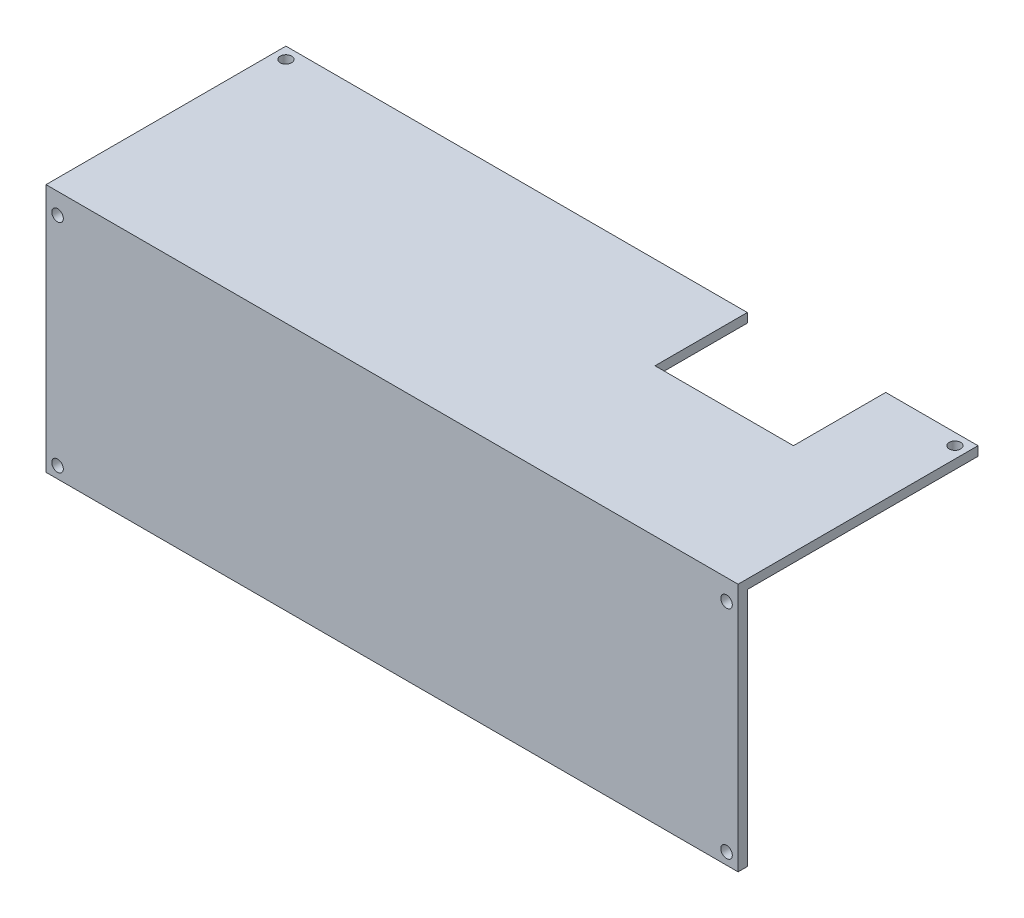
ISO-10303-21;
HEADER;
FILE_DESCRIPTION(('STEP AP214'),'2;1');
FILE_NAME('part.step','',(''),(''),'','','');
FILE_SCHEMA(('AUTOMOTIVE_DESIGN { 1 0 10303 214 1 1 1 1 }'));
ENDSEC;
DATA;
#1=APPLICATION_CONTEXT('core data for automotive mechanical design processes');
#2=APPLICATION_PROTOCOL_DEFINITION('international standard','automotive_design',2000,#1);
#3=PRODUCT_CONTEXT('',#1,'mechanical');
#4=PRODUCT('Part','Part','',(#3));
#5=PRODUCT_RELATED_PRODUCT_CATEGORY('part','',(#4));
#6=PRODUCT_DEFINITION_FORMATION('','',#4);
#7=PRODUCT_DEFINITION_CONTEXT('part definition',#1,'design');
#8=PRODUCT_DEFINITION('design','',#6,#7);
#9=PRODUCT_DEFINITION_SHAPE('','',#8);
#10=(LENGTH_UNIT() NAMED_UNIT(*) SI_UNIT(.MILLI.,.METRE.));
#11=(NAMED_UNIT(*) PLANE_ANGLE_UNIT() SI_UNIT($,.RADIAN.));
#12=(NAMED_UNIT(*) SI_UNIT($,.STERADIAN.) SOLID_ANGLE_UNIT());
#13=UNCERTAINTY_MEASURE_WITH_UNIT(LENGTH_MEASURE(1.E-05),#10,'distance_accuracy_value','');
#14=(GEOMETRIC_REPRESENTATION_CONTEXT(3) GLOBAL_UNCERTAINTY_ASSIGNED_CONTEXT((#13)) GLOBAL_UNIT_ASSIGNED_CONTEXT((#10,
#11,#12)) REPRESENTATION_CONTEXT('',''));
#15=CARTESIAN_POINT('',(0.,0.,0.));
#16=DIRECTION('',(0.,0.,1.));
#17=DIRECTION('',(1.,0.,0.));
#18=AXIS2_PLACEMENT_3D('',#15,#16,#17);
#19=CARTESIAN_POINT('',(0.,52.,0.));
#20=DIRECTION('',(0.,1.,0.));
#21=DIRECTION('',(0.,0.,1.));
#22=AXIS2_PLACEMENT_3D('',#19,#20,#21);
#23=PLANE('',#22);
#24=CARTESIAN_POINT('',(147.5,52.,-47.5));
#25=DIRECTION('',(0.,1.,0.));
#26=DIRECTION('',(0.,0.,1.));
#27=AXIS2_PLACEMENT_3D('',#24,#25,#26);
#28=CIRCLE('',#27,1.24999999999998);
#29=CARTESIAN_POINT('',(147.5,52.,-46.25));
#30=VERTEX_POINT('',#29);
#31=EDGE_CURVE('E433',#30,#30,#28,.T.);
#32=ORIENTED_EDGE('',*,*,#31,.T.);
#33=EDGE_LOOP('',(#32));
#34=FACE_BOUND('',#33,.T.);
#35=CARTESIAN_POINT('',(2.5,52.,-47.5));
#36=DIRECTION('',(0.,1.,0.));
#37=DIRECTION('',(0.,0.,1.));
#38=AXIS2_PLACEMENT_3D('',#35,#36,#37);
#39=CIRCLE('',#38,1.25);
#40=CARTESIAN_POINT('',(2.5,52.,-46.25));
#41=VERTEX_POINT('',#40);
#42=EDGE_CURVE('E444',#41,#41,#39,.T.);
#43=ORIENTED_EDGE('',*,*,#42,.T.);
#44=EDGE_LOOP('',(#43));
#45=FACE_BOUND('',#44,.T.);
#46=DIRECTION('',(0.,0.,1.));
#47=VECTOR('',#46,1.);
#48=CARTESIAN_POINT('',(100.,52.,0.));
#49=LINE('',#48,#47);
#50=CARTESIAN_POINT('',(100.,52.,-50.));
#51=VERTEX_POINT('',#50);
#52=CARTESIAN_POINT('',(100.,52.,-30.));
#53=VERTEX_POINT('',#52);
#54=EDGE_CURVE('E402',#51,#53,#49,.T.);
#55=ORIENTED_EDGE('',*,*,#54,.T.);
#56=DIRECTION('',(-1.,0.,0.));
#57=VECTOR('',#56,1.);
#58=CARTESIAN_POINT('',(0.,52.,-30.));
#59=LINE('',#58,#57);
#60=CARTESIAN_POINT('',(130.,52.,-30.));
#61=VERTEX_POINT('',#60);
#62=EDGE_CURVE('E410',#61,#53,#59,.T.);
#63=ORIENTED_EDGE('',*,*,#62,.F.);
#64=DIRECTION('',(0.,0.,1.));
#65=VECTOR('',#64,1.);
#66=CARTESIAN_POINT('',(130.,52.,0.));
#67=LINE('',#66,#65);
#68=CARTESIAN_POINT('',(130.,52.,-50.));
#69=VERTEX_POINT('',#68);
#70=EDGE_CURVE('E432',#69,#61,#67,.T.);
#71=ORIENTED_EDGE('',*,*,#70,.F.);
#72=DIRECTION('',(-1.,0.,0.));
#73=VECTOR('',#72,1.);
#74=CARTESIAN_POINT('',(150.,52.,-50.));
#75=LINE('',#74,#73);
#76=CARTESIAN_POINT('',(150.,52.,-50.));
#77=VERTEX_POINT('',#76);
#78=EDGE_CURVE('E111',#77,#69,#75,.T.);
#79=ORIENTED_EDGE('',*,*,#78,.F.);
#80=DIRECTION('',(0.,0.,-1.));
#81=VECTOR('',#80,1.);
#82=CARTESIAN_POINT('',(150.,52.,2.));
#83=LINE('',#82,#81);
#84=CARTESIAN_POINT('',(150.,52.,0.));
#85=VERTEX_POINT('',#84);
#86=EDGE_CURVE('E89',#85,#77,#83,.T.);
#87=ORIENTED_EDGE('',*,*,#86,.F.);
#88=DIRECTION('',(-1.,0.,0.));
#89=VECTOR('',#88,1.);
#90=CARTESIAN_POINT('',(0.,52.,0.));
#91=LINE('',#90,#89);
#92=CARTESIAN_POINT('',(0.,52.,0.));
#93=VERTEX_POINT('',#92);
#94=EDGE_CURVE('E99',#85,#93,#91,.T.);
#95=ORIENTED_EDGE('',*,*,#94,.T.);
#96=DIRECTION('',(0.,0.,1.));
#97=VECTOR('',#96,1.);
#98=CARTESIAN_POINT('',(0.,52.,2.));
#99=LINE('',#98,#97);
#100=CARTESIAN_POINT('',(0.,52.,-50.));
#101=VERTEX_POINT('',#100);
#102=EDGE_CURVE('E130',#101,#93,#99,.T.);
#103=ORIENTED_EDGE('',*,*,#102,.F.);
#104=EDGE_CURVE('E114',#51,#101,#75,.T.);
#105=ORIENTED_EDGE('',*,*,#104,.F.);
#106=EDGE_LOOP('',(#55,#63,#71,#79,#87,#95,#103,#105));
#107=FACE_BOUND('',#106,.T.);
#108=ADVANCED_FACE('F42',(#34,#45,#107),#23,.F.);
#109=CARTESIAN_POINT('',(150.,54.,-50.));
#110=DIRECTION('',(0.,0.,1.));
#111=DIRECTION('',(1.,0.,0.));
#112=AXIS2_PLACEMENT_3D('',#109,#110,#111);
#113=PLANE('',#112);
#114=DIRECTION('',(0.,-1.,0.));
#115=VECTOR('',#114,1.);
#116=CARTESIAN_POINT('',(100.,54.,-50.));
#117=LINE('',#116,#115);
#118=CARTESIAN_POINT('',(100.,54.,-50.));
#119=VERTEX_POINT('',#118);
#120=EDGE_CURVE('E399',#119,#51,#117,.T.);
#121=ORIENTED_EDGE('',*,*,#120,.T.);
#122=ORIENTED_EDGE('',*,*,#104,.T.);
#123=DIRECTION('',(0.,-1.,0.));
#124=VECTOR('',#123,1.);
#125=CARTESIAN_POINT('',(0.,54.,-50.));
#126=LINE('',#125,#124);
#127=CARTESIAN_POINT('',(0.,54.,-50.));
#128=VERTEX_POINT('',#127);
#129=EDGE_CURVE('E134',#128,#101,#126,.T.);
#130=ORIENTED_EDGE('',*,*,#129,.F.);
#131=DIRECTION('',(-1.,0.,0.));
#132=VECTOR('',#131,1.);
#133=CARTESIAN_POINT('',(150.,54.,-50.));
#134=LINE('',#133,#132);
#135=EDGE_CURVE('E407',#119,#128,#134,.T.);
#136=ORIENTED_EDGE('',*,*,#135,.F.);
#137=EDGE_LOOP('',(#121,#122,#130,#136));
#138=FACE_BOUND('',#137,.T.);
#139=ADVANCED_FACE('F187',(#138),#113,.F.);
#140=CARTESIAN_POINT('',(0.,54.,0.));
#141=DIRECTION('',(0.,1.,0.));
#142=DIRECTION('',(0.,0.,1.));
#143=AXIS2_PLACEMENT_3D('',#140,#141,#142);
#144=PLANE('',#143);
#145=CARTESIAN_POINT('',(147.5,54.,-47.5));
#146=DIRECTION('',(0.,1.,0.));
#147=DIRECTION('',(0.,0.,1.));
#148=AXIS2_PLACEMENT_3D('',#145,#146,#147);
#149=CIRCLE('',#148,1.24999999999998);
#150=CARTESIAN_POINT('',(147.5,54.,-46.25));
#151=VERTEX_POINT('',#150);
#152=EDGE_CURVE('E440',#151,#151,#149,.T.);
#153=ORIENTED_EDGE('',*,*,#152,.F.);
#154=EDGE_LOOP('',(#153));
#155=FACE_BOUND('',#154,.T.);
#156=CARTESIAN_POINT('',(2.5,54.,-47.5));
#157=DIRECTION('',(0.,1.,0.));
#158=DIRECTION('',(0.,0.,1.));
#159=AXIS2_PLACEMENT_3D('',#156,#157,#158);
#160=CIRCLE('',#159,1.25);
#161=CARTESIAN_POINT('',(2.5,54.,-46.25));
#162=VERTEX_POINT('',#161);
#163=EDGE_CURVE('E449',#162,#162,#160,.T.);
#164=ORIENTED_EDGE('',*,*,#163,.F.);
#165=EDGE_LOOP('',(#164));
#166=FACE_BOUND('',#165,.T.);
#167=DIRECTION('',(-1.,0.,0.));
#168=VECTOR('',#167,1.);
#169=CARTESIAN_POINT('',(0.,54.,-30.));
#170=LINE('',#169,#168);
#171=CARTESIAN_POINT('',(130.,54.,-30.));
#172=VERTEX_POINT('',#171);
#173=CARTESIAN_POINT('',(100.,54.,-30.));
#174=VERTEX_POINT('',#173);
#175=EDGE_CURVE('E57',#172,#174,#170,.T.);
#176=ORIENTED_EDGE('',*,*,#175,.T.);
#177=DIRECTION('',(0.,0.,1.));
#178=VECTOR('',#177,1.);
#179=CARTESIAN_POINT('',(100.,54.,0.));
#180=LINE('',#179,#178);
#181=EDGE_CURVE('E401',#119,#174,#180,.T.);
#182=ORIENTED_EDGE('',*,*,#181,.F.);
#183=ORIENTED_EDGE('',*,*,#135,.T.);
#184=DIRECTION('',(0.,0.,1.));
#185=VECTOR('',#184,1.);
#186=CARTESIAN_POINT('',(0.,54.,2.));
#187=LINE('',#186,#185);
#188=CARTESIAN_POINT('',(0.,54.,2.));
#189=VERTEX_POINT('',#188);
#190=EDGE_CURVE('E418',#128,#189,#187,.T.);
#191=ORIENTED_EDGE('',*,*,#190,.T.);
#192=DIRECTION('',(1.,0.,0.));
#193=VECTOR('',#192,1.);
#194=CARTESIAN_POINT('',(150.,54.,2.));
#195=LINE('',#194,#193);
#196=CARTESIAN_POINT('',(150.,54.,2.));
#197=VERTEX_POINT('',#196);
#198=EDGE_CURVE('E126',#189,#197,#195,.T.);
#199=ORIENTED_EDGE('',*,*,#198,.T.);
#200=DIRECTION('',(0.,0.,-1.));
#201=VECTOR('',#200,1.);
#202=CARTESIAN_POINT('',(150.,54.,2.));
#203=LINE('',#202,#201);
#204=CARTESIAN_POINT('',(150.,54.,-50.));
#205=VERTEX_POINT('',#204);
#206=EDGE_CURVE('E133',#197,#205,#203,.T.);
#207=ORIENTED_EDGE('',*,*,#206,.T.);
#208=CARTESIAN_POINT('',(130.,54.,-50.));
#209=VERTEX_POINT('',#208);
#210=EDGE_CURVE('E413',#205,#209,#134,.T.);
#211=ORIENTED_EDGE('',*,*,#210,.T.);
#212=DIRECTION('',(0.,0.,1.));
#213=VECTOR('',#212,1.);
#214=CARTESIAN_POINT('',(130.,54.,0.));
#215=LINE('',#214,#213);
#216=EDGE_CURVE('E409',#209,#172,#215,.T.);
#217=ORIENTED_EDGE('',*,*,#216,.T.);
#218=EDGE_LOOP('',(#176,#182,#183,#191,#199,#207,#211,#217));
#219=FACE_BOUND('',#218,.T.);
#220=ADVANCED_FACE('F193',(#155,#166,#219),#144,.T.);
#221=CARTESIAN_POINT('',(0.,0.,2.));
#222=DIRECTION('',(1.,0.,0.));
#223=DIRECTION('',(0.,1.,0.));
#224=AXIS2_PLACEMENT_3D('',#221,#222,#223);
#225=PLANE('',#224);
#226=DIRECTION('',(0.,-1.,0.));
#227=VECTOR('',#226,1.);
#228=CARTESIAN_POINT('',(0.,0.,0.));
#229=LINE('',#228,#227);
#230=CARTESIAN_POINT('',(0.,0.,0.));
#231=VERTEX_POINT('',#230);
#232=EDGE_CURVE('E102',#93,#231,#229,.T.);
#233=ORIENTED_EDGE('',*,*,#232,.T.);
#234=DIRECTION('',(0.,0.,-1.));
#235=VECTOR('',#234,1.);
#236=CARTESIAN_POINT('',(0.,0.,2.));
#237=LINE('',#236,#235);
#238=CARTESIAN_POINT('',(0.,0.,2.));
#239=VERTEX_POINT('',#238);
#240=EDGE_CURVE('E11',#239,#231,#237,.T.);
#241=ORIENTED_EDGE('',*,*,#240,.F.);
#242=DIRECTION('',(0.,-1.,0.));
#243=VECTOR('',#242,1.);
#244=CARTESIAN_POINT('',(0.,0.,2.));
#245=LINE('',#244,#243);
#246=EDGE_CURVE('E140',#189,#239,#245,.T.);
#247=ORIENTED_EDGE('',*,*,#246,.F.);
#248=ORIENTED_EDGE('',*,*,#190,.F.);
#249=ORIENTED_EDGE('',*,*,#129,.T.);
#250=ORIENTED_EDGE('',*,*,#102,.T.);
#251=EDGE_LOOP('',(#233,#241,#247,#248,#249,#250));
#252=FACE_BOUND('',#251,.T.);
#253=ADVANCED_FACE('F44',(#252),#225,.F.);
#254=CARTESIAN_POINT('',(0.,0.,2.));
#255=DIRECTION('',(0.,1.,0.));
#256=DIRECTION('',(0.,0.,1.));
#257=AXIS2_PLACEMENT_3D('',#254,#255,#256);
#258=PLANE('',#257);
#259=DIRECTION('',(1.,0.,0.));
#260=VECTOR('',#259,1.);
#261=CARTESIAN_POINT('',(0.,0.,0.));
#262=LINE('',#261,#260);
#263=CARTESIAN_POINT('',(150.,0.,0.));
#264=VERTEX_POINT('',#263);
#265=EDGE_CURVE('E95',#231,#264,#262,.T.);
#266=ORIENTED_EDGE('',*,*,#265,.T.);
#267=DIRECTION('',(0.,0.,-1.));
#268=VECTOR('',#267,1.);
#269=CARTESIAN_POINT('',(150.,0.,2.));
#270=LINE('',#269,#268);
#271=CARTESIAN_POINT('',(150.,0.,2.));
#272=VERTEX_POINT('',#271);
#273=EDGE_CURVE('E50',#272,#264,#270,.T.);
#274=ORIENTED_EDGE('',*,*,#273,.F.);
#275=DIRECTION('',(1.,0.,0.));
#276=VECTOR('',#275,1.);
#277=CARTESIAN_POINT('',(0.,0.,2.));
#278=LINE('',#277,#276);
#279=EDGE_CURVE('E66',#239,#272,#278,.T.);
#280=ORIENTED_EDGE('',*,*,#279,.F.);
#281=ORIENTED_EDGE('',*,*,#240,.T.);
#282=EDGE_LOOP('',(#266,#274,#280,#281));
#283=FACE_BOUND('',#282,.T.);
#284=ADVANCED_FACE('F308',(#283),#258,.F.);
#285=CARTESIAN_POINT('',(147.5,49.5,2.));
#286=DIRECTION('',(0.,0.,-1.));
#287=DIRECTION('',(-1.,0.,0.));
#288=AXIS2_PLACEMENT_3D('',#285,#286,#287);
#289=CYLINDRICAL_SURFACE('',#288,1.24999999999998);
#290=CARTESIAN_POINT('',(147.5,49.5,2.));
#291=DIRECTION('',(0.,0.,1.));
#292=DIRECTION('',(1.,0.,0.));
#293=AXIS2_PLACEMENT_3D('',#290,#291,#292);
#294=CIRCLE('',#293,1.24999999999998);
#295=CARTESIAN_POINT('',(148.75,49.5,2.));
#296=VERTEX_POINT('',#295);
#297=EDGE_CURVE('E152',#296,#296,#294,.T.);
#298=ORIENTED_EDGE('',*,*,#297,.T.);
#299=EDGE_LOOP('',(#298));
#300=FACE_BOUND('',#299,.T.);
#301=CARTESIAN_POINT('',(147.5,49.5,0.));
#302=DIRECTION('',(0.,0.,1.));
#303=DIRECTION('',(1.,0.,0.));
#304=AXIS2_PLACEMENT_3D('',#301,#302,#303);
#305=CIRCLE('',#304,1.24999999999998);
#306=CARTESIAN_POINT('',(148.75,49.5,0.));
#307=VERTEX_POINT('',#306);
#308=EDGE_CURVE('E165',#307,#307,#305,.T.);
#309=ORIENTED_EDGE('',*,*,#308,.F.);
#310=EDGE_LOOP('',(#309));
#311=FACE_BOUND('',#310,.T.);
#312=ADVANCED_FACE('F337',(#300,#311),#289,.F.);
#313=CARTESIAN_POINT('',(2.50000000000001,2.5,2.));
#314=DIRECTION('',(0.,0.,-1.));
#315=DIRECTION('',(-1.,0.,0.));
#316=AXIS2_PLACEMENT_3D('',#313,#314,#315);
#317=CYLINDRICAL_SURFACE('',#316,1.25);
#318=CARTESIAN_POINT('',(2.50000000000001,2.5,2.));
#319=DIRECTION('',(0.,0.,1.));
#320=DIRECTION('',(1.,0.,0.));
#321=AXIS2_PLACEMENT_3D('',#318,#319,#320);
#322=CIRCLE('',#321,1.25);
#323=CARTESIAN_POINT('',(3.75000000000001,2.5,2.));
#324=VERTEX_POINT('',#323);
#325=EDGE_CURVE('E149',#324,#324,#322,.T.);
#326=ORIENTED_EDGE('',*,*,#325,.T.);
#327=EDGE_LOOP('',(#326));
#328=FACE_BOUND('',#327,.T.);
#329=CARTESIAN_POINT('',(2.50000000000001,2.5,0.));
#330=DIRECTION('',(0.,0.,1.));
#331=DIRECTION('',(1.,0.,0.));
#332=AXIS2_PLACEMENT_3D('',#329,#330,#331);
#333=CIRCLE('',#332,1.25);
#334=CARTESIAN_POINT('',(3.75000000000001,2.5,0.));
#335=VERTEX_POINT('',#334);
#336=EDGE_CURVE('E162',#335,#335,#333,.T.);
#337=ORIENTED_EDGE('',*,*,#336,.F.);
#338=EDGE_LOOP('',(#337));
#339=FACE_BOUND('',#338,.T.);
#340=ADVANCED_FACE('F327',(#328,#339),#317,.F.);
#341=CARTESIAN_POINT('',(2.5,49.5,2.));
#342=DIRECTION('',(0.,0.,-1.));
#343=DIRECTION('',(-1.,0.,0.));
#344=AXIS2_PLACEMENT_3D('',#341,#342,#343);
#345=CYLINDRICAL_SURFACE('',#344,1.25);
#346=CARTESIAN_POINT('',(2.5,49.5,2.));
#347=DIRECTION('',(0.,0.,1.));
#348=DIRECTION('',(1.,0.,0.));
#349=AXIS2_PLACEMENT_3D('',#346,#347,#348);
#350=CIRCLE('',#349,1.25);
#351=CARTESIAN_POINT('',(3.75000000000001,49.5,2.));
#352=VERTEX_POINT('',#351);
#353=EDGE_CURVE('E146',#352,#352,#350,.T.);
#354=ORIENTED_EDGE('',*,*,#353,.T.);
#355=EDGE_LOOP('',(#354));
#356=FACE_BOUND('',#355,.T.);
#357=CARTESIAN_POINT('',(2.5,49.5,0.));
#358=DIRECTION('',(0.,0.,1.));
#359=DIRECTION('',(1.,0.,0.));
#360=AXIS2_PLACEMENT_3D('',#357,#358,#359);
#361=CIRCLE('',#360,1.25);
#362=CARTESIAN_POINT('',(3.75000000000001,49.5,0.));
#363=VERTEX_POINT('',#362);
#364=EDGE_CURVE('E94',#363,#363,#361,.T.);
#365=ORIENTED_EDGE('',*,*,#364,.F.);
#366=EDGE_LOOP('',(#365));
#367=FACE_BOUND('',#366,.T.);
#368=ADVANCED_FACE('F182',(#356,#367),#345,.F.);
#369=CARTESIAN_POINT('',(150.,0.,2.));
#370=DIRECTION('',(-1.,0.,0.));
#371=DIRECTION('',(0.,0.,1.));
#372=AXIS2_PLACEMENT_3D('',#369,#370,#371);
#373=PLANE('',#372);
#374=DIRECTION('',(0.,1.,0.));
#375=VECTOR('',#374,1.);
#376=CARTESIAN_POINT('',(150.,0.,0.));
#377=LINE('',#376,#375);
#378=EDGE_CURVE('E83',#264,#85,#377,.T.);
#379=ORIENTED_EDGE('',*,*,#378,.T.);
#380=ORIENTED_EDGE('',*,*,#86,.T.);
#381=DIRECTION('',(0.,-1.,0.));
#382=VECTOR('',#381,1.);
#383=CARTESIAN_POINT('',(150.,54.,-50.));
#384=LINE('',#383,#382);
#385=EDGE_CURVE('E106',#205,#77,#384,.T.);
#386=ORIENTED_EDGE('',*,*,#385,.F.);
#387=ORIENTED_EDGE('',*,*,#206,.F.);
#388=DIRECTION('',(0.,1.,0.));
#389=VECTOR('',#388,1.);
#390=CARTESIAN_POINT('',(150.,0.,2.));
#391=LINE('',#390,#389);
#392=EDGE_CURVE('E144',#272,#197,#391,.T.);
#393=ORIENTED_EDGE('',*,*,#392,.F.);
#394=ORIENTED_EDGE('',*,*,#273,.T.);
#395=EDGE_LOOP('',(#379,#380,#386,#387,#393,#394));
#396=FACE_BOUND('',#395,.T.);
#397=ADVANCED_FACE('F85',(#396),#373,.F.);
#398=CARTESIAN_POINT('',(147.5,2.5,2.));
#399=DIRECTION('',(0.,0.,-1.));
#400=DIRECTION('',(-1.,0.,0.));
#401=AXIS2_PLACEMENT_3D('',#398,#399,#400);
#402=CYLINDRICAL_SURFACE('',#401,1.25000000000001);
#403=CARTESIAN_POINT('',(147.5,2.5,2.));
#404=DIRECTION('',(0.,0.,1.));
#405=DIRECTION('',(1.,0.,0.));
#406=AXIS2_PLACEMENT_3D('',#403,#404,#405);
#407=CIRCLE('',#406,1.25000000000001);
#408=CARTESIAN_POINT('',(148.75,2.5,2.));
#409=VERTEX_POINT('',#408);
#410=EDGE_CURVE('E155',#409,#409,#407,.T.);
#411=ORIENTED_EDGE('',*,*,#410,.T.);
#412=EDGE_LOOP('',(#411));
#413=FACE_BOUND('',#412,.T.);
#414=CARTESIAN_POINT('',(147.5,2.5,0.));
#415=DIRECTION('',(0.,0.,1.));
#416=DIRECTION('',(1.,0.,0.));
#417=AXIS2_PLACEMENT_3D('',#414,#415,#416);
#418=CIRCLE('',#417,1.25000000000001);
#419=CARTESIAN_POINT('',(148.75,2.5,0.));
#420=VERTEX_POINT('',#419);
#421=EDGE_CURVE('E142',#420,#420,#418,.T.);
#422=ORIENTED_EDGE('',*,*,#421,.F.);
#423=EDGE_LOOP('',(#422));
#424=FACE_BOUND('',#423,.T.);
#425=ADVANCED_FACE('F172',(#413,#424),#402,.F.);
#426=CARTESIAN_POINT('',(0.,0.,2.));
#427=DIRECTION('',(0.,0.,1.));
#428=DIRECTION('',(1.,0.,0.));
#429=AXIS2_PLACEMENT_3D('',#426,#427,#428);
#430=PLANE('',#429);
#431=ORIENTED_EDGE('',*,*,#392,.T.);
#432=ORIENTED_EDGE('',*,*,#198,.F.);
#433=ORIENTED_EDGE('',*,*,#246,.T.);
#434=ORIENTED_EDGE('',*,*,#279,.T.);
#435=EDGE_LOOP('',(#431,#432,#433,#434));
#436=FACE_BOUND('',#435,.T.);
#437=ORIENTED_EDGE('',*,*,#353,.F.);
#438=EDGE_LOOP('',(#437));
#439=FACE_BOUND('',#438,.T.);
#440=ORIENTED_EDGE('',*,*,#325,.F.);
#441=EDGE_LOOP('',(#440));
#442=FACE_BOUND('',#441,.T.);
#443=ORIENTED_EDGE('',*,*,#297,.F.);
#444=EDGE_LOOP('',(#443));
#445=FACE_BOUND('',#444,.T.);
#446=ORIENTED_EDGE('',*,*,#410,.F.);
#447=EDGE_LOOP('',(#446));
#448=FACE_BOUND('',#447,.T.);
#449=ADVANCED_FACE('F174',(#436,#439,#442,#445,#448),#430,.T.);
#450=CARTESIAN_POINT('',(0.,0.,0.));
#451=DIRECTION('',(0.,0.,1.));
#452=DIRECTION('',(1.,0.,0.));
#453=AXIS2_PLACEMENT_3D('',#450,#451,#452);
#454=PLANE('',#453);
#455=ORIENTED_EDGE('',*,*,#94,.F.);
#456=ORIENTED_EDGE('',*,*,#378,.F.);
#457=ORIENTED_EDGE('',*,*,#265,.F.);
#458=ORIENTED_EDGE('',*,*,#232,.F.);
#459=EDGE_LOOP('',(#455,#456,#457,#458));
#460=FACE_BOUND('',#459,.T.);
#461=ORIENTED_EDGE('',*,*,#364,.T.);
#462=EDGE_LOOP('',(#461));
#463=FACE_BOUND('',#462,.T.);
#464=ORIENTED_EDGE('',*,*,#336,.T.);
#465=EDGE_LOOP('',(#464));
#466=FACE_BOUND('',#465,.T.);
#467=ORIENTED_EDGE('',*,*,#308,.T.);
#468=EDGE_LOOP('',(#467));
#469=FACE_BOUND('',#468,.T.);
#470=ORIENTED_EDGE('',*,*,#421,.T.);
#471=EDGE_LOOP('',(#470));
#472=FACE_BOUND('',#471,.T.);
#473=ADVANCED_FACE('F100',(#460,#463,#466,#469,#472),#454,.F.);
#474=ORIENTED_EDGE('',*,*,#78,.T.);
#475=DIRECTION('',(0.,-1.,0.));
#476=VECTOR('',#475,1.);
#477=CARTESIAN_POINT('',(130.,54.,-50.));
#478=LINE('',#477,#476);
#479=EDGE_CURVE('E404',#209,#69,#478,.T.);
#480=ORIENTED_EDGE('',*,*,#479,.F.);
#481=ORIENTED_EDGE('',*,*,#210,.F.);
#482=ORIENTED_EDGE('',*,*,#385,.T.);
#483=EDGE_LOOP('',(#474,#480,#481,#482));
#484=FACE_BOUND('',#483,.T.);
#485=ADVANCED_FACE('F196',(#484),#113,.F.);
#486=CARTESIAN_POINT('',(100.,54.,0.));
#487=DIRECTION('',(1.,0.,0.));
#488=DIRECTION('',(0.,0.,-1.));
#489=AXIS2_PLACEMENT_3D('',#486,#487,#488);
#490=PLANE('',#489);
#491=ORIENTED_EDGE('',*,*,#54,.F.);
#492=ORIENTED_EDGE('',*,*,#120,.F.);
#493=ORIENTED_EDGE('',*,*,#181,.T.);
#494=DIRECTION('',(0.,-1.,0.));
#495=VECTOR('',#494,1.);
#496=CARTESIAN_POINT('',(100.,54.,-30.));
#497=LINE('',#496,#495);
#498=EDGE_CURVE('E115',#174,#53,#497,.T.);
#499=ORIENTED_EDGE('',*,*,#498,.T.);
#500=EDGE_LOOP('',(#491,#492,#493,#499));
#501=FACE_BOUND('',#500,.T.);
#502=ADVANCED_FACE('F202',(#501),#490,.T.);
#503=CARTESIAN_POINT('',(0.,54.,-30.));
#504=DIRECTION('',(0.,0.,1.));
#505=DIRECTION('',(1.,0.,0.));
#506=AXIS2_PLACEMENT_3D('',#503,#504,#505);
#507=PLANE('',#506);
#508=ORIENTED_EDGE('',*,*,#62,.T.);
#509=ORIENTED_EDGE('',*,*,#498,.F.);
#510=ORIENTED_EDGE('',*,*,#175,.F.);
#511=DIRECTION('',(0.,-1.,0.));
#512=VECTOR('',#511,1.);
#513=CARTESIAN_POINT('',(130.,54.,-30.));
#514=LINE('',#513,#512);
#515=EDGE_CURVE('E123',#172,#61,#514,.T.);
#516=ORIENTED_EDGE('',*,*,#515,.T.);
#517=EDGE_LOOP('',(#508,#509,#510,#516));
#518=FACE_BOUND('',#517,.T.);
#519=ADVANCED_FACE('F220',(#518),#507,.F.);
#520=CARTESIAN_POINT('',(130.,54.,0.));
#521=DIRECTION('',(1.,0.,0.));
#522=DIRECTION('',(0.,0.,-1.));
#523=AXIS2_PLACEMENT_3D('',#520,#521,#522);
#524=PLANE('',#523);
#525=ORIENTED_EDGE('',*,*,#70,.T.);
#526=ORIENTED_EDGE('',*,*,#515,.F.);
#527=ORIENTED_EDGE('',*,*,#216,.F.);
#528=ORIENTED_EDGE('',*,*,#479,.T.);
#529=EDGE_LOOP('',(#525,#526,#527,#528));
#530=FACE_BOUND('',#529,.T.);
#531=ADVANCED_FACE('F227',(#530),#524,.F.);
#532=CARTESIAN_POINT('',(2.5,52.,-47.5));
#533=DIRECTION('',(0.,1.,0.));
#534=DIRECTION('',(0.,0.,1.));
#535=AXIS2_PLACEMENT_3D('',#532,#533,#534);
#536=CYLINDRICAL_SURFACE('',#535,1.25);
#537=ORIENTED_EDGE('',*,*,#42,.F.);
#538=EDGE_LOOP('',(#537));
#539=FACE_BOUND('',#538,.T.);
#540=ORIENTED_EDGE('',*,*,#163,.T.);
#541=EDGE_LOOP('',(#540));
#542=FACE_BOUND('',#541,.T.);
#543=ADVANCED_FACE('F234',(#539,#542),#536,.F.);
#544=CARTESIAN_POINT('',(147.5,52.,-47.5));
#545=DIRECTION('',(0.,1.,0.));
#546=DIRECTION('',(0.,0.,1.));
#547=AXIS2_PLACEMENT_3D('',#544,#545,#546);
#548=CYLINDRICAL_SURFACE('',#547,1.24999999999998);
#549=ORIENTED_EDGE('',*,*,#31,.F.);
#550=EDGE_LOOP('',(#549));
#551=FACE_BOUND('',#550,.T.);
#552=ORIENTED_EDGE('',*,*,#152,.T.);
#553=EDGE_LOOP('',(#552));
#554=FACE_BOUND('',#553,.T.);
#555=ADVANCED_FACE('F243',(#551,#554),#548,.F.);
#556=CLOSED_SHELL('',(#108,#139,#220,#253,#284,#312,#340,#368,#397,#425,#449,#473,#485,#502,
#519,#531,#543,#555));
#557=MANIFOLD_SOLID_BREP('B2',#556);
#558=ADVANCED_BREP_SHAPE_REPRESENTATION('',(#18,#557),#14);
#559=SHAPE_DEFINITION_REPRESENTATION(#9,#558);
ENDSEC;
END-ISO-10303-21;
